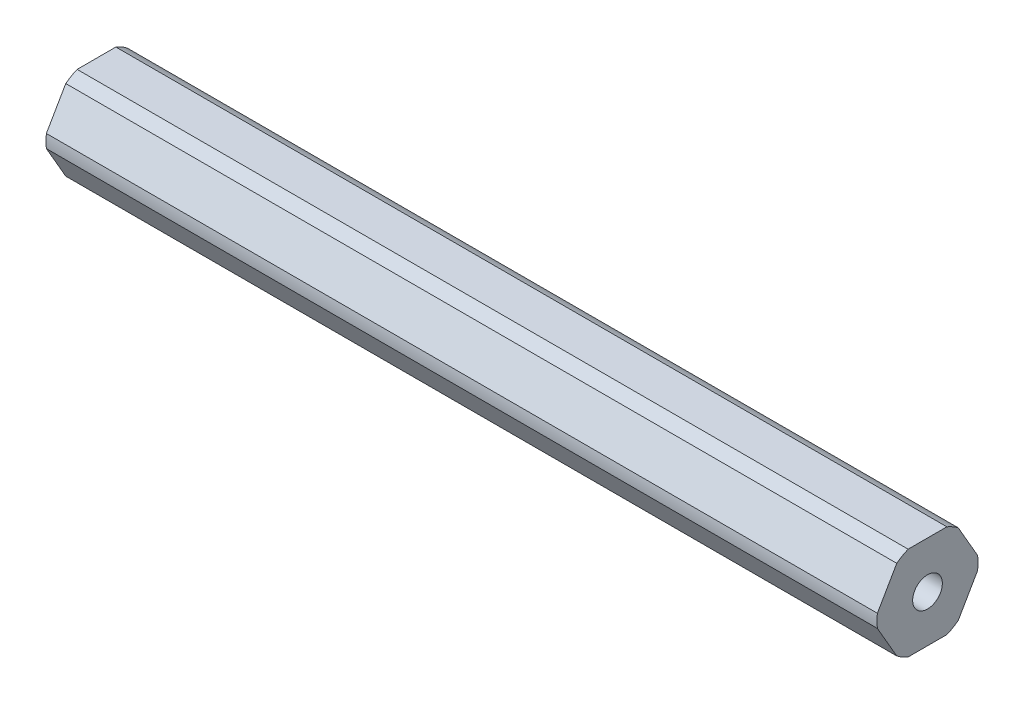
ISO-10303-21;
HEADER;
FILE_DESCRIPTION(('STEP AP214'),'2;1');
FILE_NAME('part.step','',(''),(''),'','','');
FILE_SCHEMA(('AUTOMOTIVE_DESIGN { 1 0 10303 214 1 1 1 1 }'));
ENDSEC;
DATA;
#1=APPLICATION_CONTEXT('core data for automotive mechanical design processes');
#2=APPLICATION_PROTOCOL_DEFINITION('international standard','automotive_design',2000,#1);
#3=PRODUCT_CONTEXT('',#1,'mechanical');
#4=PRODUCT('Part','Part','',(#3));
#5=PRODUCT_RELATED_PRODUCT_CATEGORY('part','',(#4));
#6=PRODUCT_DEFINITION_FORMATION('','',#4);
#7=PRODUCT_DEFINITION_CONTEXT('part definition',#1,'design');
#8=PRODUCT_DEFINITION('design','',#6,#7);
#9=PRODUCT_DEFINITION_SHAPE('','',#8);
#10=(LENGTH_UNIT() NAMED_UNIT(*) SI_UNIT(.MILLI.,.METRE.));
#11=(NAMED_UNIT(*) PLANE_ANGLE_UNIT() SI_UNIT($,.RADIAN.));
#12=(NAMED_UNIT(*) SI_UNIT($,.STERADIAN.) SOLID_ANGLE_UNIT());
#13=UNCERTAINTY_MEASURE_WITH_UNIT(LENGTH_MEASURE(1.E-05),#10,'distance_accuracy_value','');
#14=(GEOMETRIC_REPRESENTATION_CONTEXT(3) GLOBAL_UNCERTAINTY_ASSIGNED_CONTEXT((#13)) GLOBAL_UNIT_ASSIGNED_CONTEXT((#10,
#11,#12)) REPRESENTATION_CONTEXT('',''));
#15=CARTESIAN_POINT('',(0.,0.,0.));
#16=DIRECTION('',(0.,0.,1.));
#17=DIRECTION('',(1.,0.,0.));
#18=AXIS2_PLACEMENT_3D('',#15,#16,#17);
#19=CARTESIAN_POINT('',(56.515,3.17499999999999,-5.49926131403116));
#20=DIRECTION('',(0.,-0.500000000000001,0.866025403784438));
#21=DIRECTION('',(0.,-0.866025403784438,-0.500000000000001));
#22=AXIS2_PLACEMENT_3D('',#19,#20,#21);
#23=PLANE('',#22);
#24=DIRECTION('',(0.,0.866025403784438,0.500000000000001));
#25=VECTOR('',#24,1.);
#26=CARTESIAN_POINT('',(-56.515,3.17499999999999,-5.49926131403116));
#27=LINE('',#26,#25);
#28=CARTESIAN_POINT('',(-56.515,0.89303957103212,-6.81675178197584));
#29=VERTEX_POINT('',#28);
#30=CARTESIAN_POINT('',(-56.515,5.45696042896787,-4.18177084608648));
#31=VERTEX_POINT('',#30);
#32=EDGE_CURVE('E161',#29,#31,#27,.T.);
#33=ORIENTED_EDGE('',*,*,#32,.T.);
#34=DIRECTION('',(-1.,0.,0.));
#35=VECTOR('',#34,1.);
#36=CARTESIAN_POINT('',(56.515,5.45696042896787,-4.18177084608648));
#37=LINE('',#36,#35);
#38=CARTESIAN_POINT('',(56.515,5.45696042896787,-4.18177084608648));
#39=VERTEX_POINT('',#38);
#40=EDGE_CURVE('E11',#39,#31,#37,.T.);
#41=ORIENTED_EDGE('',*,*,#40,.F.);
#42=DIRECTION('',(0.,0.866025403784438,0.500000000000001));
#43=VECTOR('',#42,1.);
#44=CARTESIAN_POINT('',(56.515,3.17499999999999,-5.49926131403116));
#45=LINE('',#44,#43);
#46=CARTESIAN_POINT('',(56.515,0.89303957103212,-6.81675178197584));
#47=VERTEX_POINT('',#46);
#48=EDGE_CURVE('E220',#47,#39,#45,.T.);
#49=ORIENTED_EDGE('',*,*,#48,.F.);
#50=DIRECTION('',(-1.,0.,0.));
#51=VECTOR('',#50,1.);
#52=CARTESIAN_POINT('',(56.515,0.89303957103212,-6.81675178197584));
#53=LINE('',#52,#51);
#54=EDGE_CURVE('E154',#47,#29,#53,.T.);
#55=ORIENTED_EDGE('',*,*,#54,.T.);
#56=EDGE_LOOP('',(#33,#41,#49,#55));
#57=FACE_BOUND('',#56,.T.);
#58=ADVANCED_FACE('F36',(#57),#23,.F.);
#59=CARTESIAN_POINT('',(56.515,0.,0.));
#60=DIRECTION('',(-1.,0.,0.));
#61=DIRECTION('',(0.,0.,1.));
#62=AXIS2_PLACEMENT_3D('',#59,#60,#61);
#63=CYLINDRICAL_SURFACE('',#62,6.874999966);
#64=CARTESIAN_POINT('',(-56.515,0.,0.));
#65=DIRECTION('',(1.,0.,0.));
#66=DIRECTION('',(0.,0.,-1.));
#67=AXIS2_PLACEMENT_3D('',#64,#65,#66);
#68=CIRCLE('',#67,6.874999966);
#69=CARTESIAN_POINT('',(-56.515,6.34999999999998,-2.63498093588933));
#70=VERTEX_POINT('',#69);
#71=EDGE_CURVE('E164',#31,#70,#68,.T.);
#72=ORIENTED_EDGE('',*,*,#71,.T.);
#73=DIRECTION('',(-1.,0.,0.));
#74=VECTOR('',#73,1.);
#75=CARTESIAN_POINT('',(56.515,6.34999999999998,-2.63498093588933));
#76=LINE('',#75,#74);
#77=CARTESIAN_POINT('',(56.515,6.34999999999998,-2.63498093588933));
#78=VERTEX_POINT('',#77);
#79=EDGE_CURVE('E45',#78,#70,#76,.T.);
#80=ORIENTED_EDGE('',*,*,#79,.F.);
#81=CARTESIAN_POINT('',(56.515,0.,0.));
#82=DIRECTION('',(1.,0.,0.));
#83=DIRECTION('',(0.,0.,-1.));
#84=AXIS2_PLACEMENT_3D('',#81,#82,#83);
#85=CIRCLE('',#84,6.874999966);
#86=EDGE_CURVE('E108',#39,#78,#85,.T.);
#87=ORIENTED_EDGE('',*,*,#86,.F.);
#88=ORIENTED_EDGE('',*,*,#40,.T.);
#89=EDGE_LOOP('',(#72,#80,#87,#88));
#90=FACE_BOUND('',#89,.T.);
#91=ADVANCED_FACE('F255',(#90),#63,.T.);
#92=CARTESIAN_POINT('',(56.515,6.34999999999997,0.));
#93=DIRECTION('',(0.,-1.,0.));
#94=DIRECTION('',(0.,0.,-1.));
#95=AXIS2_PLACEMENT_3D('',#92,#93,#94);
#96=PLANE('',#95);
#97=DIRECTION('',(0.,0.,1.));
#98=VECTOR('',#97,1.);
#99=CARTESIAN_POINT('',(-56.515,6.34999999999997,0.));
#100=LINE('',#99,#98);
#101=CARTESIAN_POINT('',(-56.515,6.34999999999997,2.63498093588938));
#102=VERTEX_POINT('',#101);
#103=EDGE_CURVE('E166',#70,#102,#100,.T.);
#104=ORIENTED_EDGE('',*,*,#103,.T.);
#105=DIRECTION('',(-1.,0.,0.));
#106=VECTOR('',#105,1.);
#107=CARTESIAN_POINT('',(56.515,6.34999999999997,2.63498093588938));
#108=LINE('',#107,#106);
#109=CARTESIAN_POINT('',(56.515,6.34999999999997,2.63498093588938));
#110=VERTEX_POINT('',#109);
#111=EDGE_CURVE('E196',#110,#102,#108,.T.);
#112=ORIENTED_EDGE('',*,*,#111,.F.);
#113=DIRECTION('',(0.,0.,1.));
#114=VECTOR('',#113,1.);
#115=CARTESIAN_POINT('',(56.515,6.34999999999997,0.));
#116=LINE('',#115,#114);
#117=EDGE_CURVE('E204',#78,#110,#116,.T.);
#118=ORIENTED_EDGE('',*,*,#117,.F.);
#119=ORIENTED_EDGE('',*,*,#79,.T.);
#120=EDGE_LOOP('',(#104,#112,#118,#119));
#121=FACE_BOUND('',#120,.T.);
#122=ADVANCED_FACE('F202',(#121),#96,.F.);
#123=CARTESIAN_POINT('',(-56.515,5.45696042896784,4.18177084608651));
#124=VERTEX_POINT('',#123);
#125=EDGE_CURVE('E167',#102,#124,#68,.T.);
#126=ORIENTED_EDGE('',*,*,#125,.T.);
#127=DIRECTION('',(-1.,0.,0.));
#128=VECTOR('',#127,1.);
#129=CARTESIAN_POINT('',(56.515,5.45696042896784,4.18177084608651));
#130=LINE('',#129,#128);
#131=CARTESIAN_POINT('',(56.515,5.45696042896784,4.18177084608651));
#132=VERTEX_POINT('',#131);
#133=EDGE_CURVE('E193',#132,#124,#130,.T.);
#134=ORIENTED_EDGE('',*,*,#133,.F.);
#135=EDGE_CURVE('E226',#110,#132,#85,.T.);
#136=ORIENTED_EDGE('',*,*,#135,.F.);
#137=ORIENTED_EDGE('',*,*,#111,.T.);
#138=EDGE_LOOP('',(#126,#134,#136,#137));
#139=FACE_BOUND('',#138,.T.);
#140=ADVANCED_FACE('F237',(#139),#63,.T.);
#141=CARTESIAN_POINT('',(56.515,3.17499999999995,5.49926131403118));
#142=DIRECTION('',(0.,-0.499999999999995,-0.866025403784442));
#143=DIRECTION('',(0.,0.866025403784442,-0.499999999999995));
#144=AXIS2_PLACEMENT_3D('',#141,#142,#143);
#145=PLANE('',#144);
#146=DIRECTION('',(0.,-0.866025403784442,0.499999999999995));
#147=VECTOR('',#146,1.);
#148=CARTESIAN_POINT('',(-56.515,3.17499999999995,5.49926131403118));
#149=LINE('',#148,#147);
#150=CARTESIAN_POINT('',(-56.515,0.893039571032066,6.81675178197585));
#151=VERTEX_POINT('',#150);
#152=EDGE_CURVE('E169',#124,#151,#149,.T.);
#153=ORIENTED_EDGE('',*,*,#152,.T.);
#154=DIRECTION('',(-1.,0.,0.));
#155=VECTOR('',#154,1.);
#156=CARTESIAN_POINT('',(56.515,0.893039571032066,6.81675178197585));
#157=LINE('',#156,#155);
#158=CARTESIAN_POINT('',(56.515,0.893039571032066,6.81675178197585));
#159=VERTEX_POINT('',#158);
#160=EDGE_CURVE('E190',#159,#151,#157,.T.);
#161=ORIENTED_EDGE('',*,*,#160,.F.);
#162=DIRECTION('',(0.,-0.866025403784442,0.499999999999995));
#163=VECTOR('',#162,1.);
#164=CARTESIAN_POINT('',(56.515,3.17499999999995,5.49926131403118));
#165=LINE('',#164,#163);
#166=EDGE_CURVE('E228',#132,#159,#165,.T.);
#167=ORIENTED_EDGE('',*,*,#166,.F.);
#168=ORIENTED_EDGE('',*,*,#133,.T.);
#169=EDGE_LOOP('',(#153,#161,#167,#168));
#170=FACE_BOUND('',#169,.T.);
#171=ADVANCED_FACE('F239',(#170),#145,.F.);
#172=CARTESIAN_POINT('',(-56.515,-0.893039571032163,6.81675178197583));
#173=VERTEX_POINT('',#172);
#174=EDGE_CURVE('E171',#151,#173,#68,.T.);
#175=ORIENTED_EDGE('',*,*,#174,.T.);
#176=DIRECTION('',(-1.,0.,0.));
#177=VECTOR('',#176,1.);
#178=CARTESIAN_POINT('',(56.515,-0.893039571032163,6.81675178197583));
#179=LINE('',#178,#177);
#180=CARTESIAN_POINT('',(56.515,-0.893039571032163,6.81675178197583));
#181=VERTEX_POINT('',#180);
#182=EDGE_CURVE('E187',#181,#173,#179,.T.);
#183=ORIENTED_EDGE('',*,*,#182,.F.);
#184=EDGE_CURVE('E229',#159,#181,#85,.T.);
#185=ORIENTED_EDGE('',*,*,#184,.F.);
#186=ORIENTED_EDGE('',*,*,#160,.T.);
#187=EDGE_LOOP('',(#175,#183,#185,#186));
#188=FACE_BOUND('',#187,.T.);
#189=ADVANCED_FACE('F240',(#188),#63,.T.);
#190=CARTESIAN_POINT('',(56.515,-3.17500000000003,5.49926131403114));
#191=DIRECTION('',(0.,0.500000000000007,-0.866025403784434));
#192=DIRECTION('',(0.,0.866025403784435,0.500000000000007));
#193=AXIS2_PLACEMENT_3D('',#190,#191,#192);
#194=PLANE('',#193);
#195=DIRECTION('',(0.,-0.866025403784435,-0.500000000000007));
#196=VECTOR('',#195,1.);
#197=CARTESIAN_POINT('',(-56.515,-3.17500000000003,5.49926131403114));
#198=LINE('',#197,#196);
#199=CARTESIAN_POINT('',(-56.515,-5.4569604289679,4.18177084608644));
#200=VERTEX_POINT('',#199);
#201=EDGE_CURVE('E172',#173,#200,#198,.T.);
#202=ORIENTED_EDGE('',*,*,#201,.T.);
#203=DIRECTION('',(-1.,0.,0.));
#204=VECTOR('',#203,1.);
#205=CARTESIAN_POINT('',(56.515,-5.4569604289679,4.18177084608644));
#206=LINE('',#205,#204);
#207=CARTESIAN_POINT('',(56.515,-5.4569604289679,4.18177084608644));
#208=VERTEX_POINT('',#207);
#209=EDGE_CURVE('E184',#208,#200,#206,.T.);
#210=ORIENTED_EDGE('',*,*,#209,.F.);
#211=DIRECTION('',(0.,-0.866025403784435,-0.500000000000007));
#212=VECTOR('',#211,1.);
#213=CARTESIAN_POINT('',(56.515,-3.17500000000003,5.49926131403114));
#214=LINE('',#213,#212);
#215=EDGE_CURVE('E230',#181,#208,#214,.T.);
#216=ORIENTED_EDGE('',*,*,#215,.F.);
#217=ORIENTED_EDGE('',*,*,#182,.T.);
#218=EDGE_LOOP('',(#202,#210,#216,#217));
#219=FACE_BOUND('',#218,.T.);
#220=ADVANCED_FACE('F243',(#219),#194,.F.);
#221=CARTESIAN_POINT('',(-56.515,-6.35,2.63498093588929));
#222=VERTEX_POINT('',#221);
#223=EDGE_CURVE('E174',#200,#222,#68,.T.);
#224=ORIENTED_EDGE('',*,*,#223,.T.);
#225=DIRECTION('',(-1.,0.,0.));
#226=VECTOR('',#225,1.);
#227=CARTESIAN_POINT('',(56.515,-6.35,2.63498093588929));
#228=LINE('',#227,#226);
#229=CARTESIAN_POINT('',(56.515,-6.35,2.63498093588929));
#230=VERTEX_POINT('',#229);
#231=EDGE_CURVE('E181',#230,#222,#228,.T.);
#232=ORIENTED_EDGE('',*,*,#231,.F.);
#233=EDGE_CURVE('E144',#208,#230,#85,.T.);
#234=ORIENTED_EDGE('',*,*,#233,.F.);
#235=ORIENTED_EDGE('',*,*,#209,.T.);
#236=EDGE_LOOP('',(#224,#232,#234,#235));
#237=FACE_BOUND('',#236,.T.);
#238=ADVANCED_FACE('F245',(#237),#63,.T.);
#239=CARTESIAN_POINT('',(56.515,-6.34999999999997,0.));
#240=DIRECTION('',(0.,1.,0.));
#241=DIRECTION('',(0.,0.,1.));
#242=AXIS2_PLACEMENT_3D('',#239,#240,#241);
#243=PLANE('',#242);
#244=DIRECTION('',(0.,0.,-1.));
#245=VECTOR('',#244,1.);
#246=CARTESIAN_POINT('',(-56.515,-6.34999999999997,0.));
#247=LINE('',#246,#245);
#248=CARTESIAN_POINT('',(-56.515,-6.34999999999994,-2.63498093588942));
#249=VERTEX_POINT('',#248);
#250=EDGE_CURVE('E175',#222,#249,#247,.T.);
#251=ORIENTED_EDGE('',*,*,#250,.T.);
#252=DIRECTION('',(-1.,0.,0.));
#253=VECTOR('',#252,1.);
#254=CARTESIAN_POINT('',(56.515,-6.34999999999994,-2.63498093588942));
#255=LINE('',#254,#253);
#256=CARTESIAN_POINT('',(56.515,-6.34999999999994,-2.63498093588942));
#257=VERTEX_POINT('',#256);
#258=EDGE_CURVE('E149',#257,#249,#255,.T.);
#259=ORIENTED_EDGE('',*,*,#258,.F.);
#260=DIRECTION('',(0.,0.,-1.));
#261=VECTOR('',#260,1.);
#262=CARTESIAN_POINT('',(56.515,-6.34999999999997,0.));
#263=LINE('',#262,#261);
#264=EDGE_CURVE('E139',#230,#257,#263,.T.);
#265=ORIENTED_EDGE('',*,*,#264,.F.);
#266=ORIENTED_EDGE('',*,*,#231,.T.);
#267=EDGE_LOOP('',(#251,#259,#265,#266));
#268=FACE_BOUND('',#267,.T.);
#269=ADVANCED_FACE('F248',(#268),#243,.F.);
#270=CARTESIAN_POINT('',(-56.515,-5.4569604289678,-4.18177084608657));
#271=VERTEX_POINT('',#270);
#272=EDGE_CURVE('E148',#249,#271,#68,.T.);
#273=ORIENTED_EDGE('',*,*,#272,.T.);
#274=DIRECTION('',(-1.,0.,0.));
#275=VECTOR('',#274,1.);
#276=CARTESIAN_POINT('',(56.515,-5.4569604289678,-4.18177084608657));
#277=LINE('',#276,#275);
#278=CARTESIAN_POINT('',(56.515,-5.4569604289678,-4.18177084608657));
#279=VERTEX_POINT('',#278);
#280=EDGE_CURVE('E145',#279,#271,#277,.T.);
#281=ORIENTED_EDGE('',*,*,#280,.F.);
#282=EDGE_CURVE('E133',#257,#279,#85,.T.);
#283=ORIENTED_EDGE('',*,*,#282,.F.);
#284=ORIENTED_EDGE('',*,*,#258,.T.);
#285=EDGE_LOOP('',(#273,#281,#283,#284));
#286=FACE_BOUND('',#285,.T.);
#287=ADVANCED_FACE('F146',(#286),#63,.T.);
#288=CARTESIAN_POINT('',(56.515,-3.17499999999997,-5.4992613140312));
#289=DIRECTION('',(0.,0.499999999999995,0.866025403784441));
#290=DIRECTION('',(0.,-0.866025403784442,0.499999999999995));
#291=AXIS2_PLACEMENT_3D('',#288,#289,#290);
#292=PLANE('',#291);
#293=DIRECTION('',(0.,0.866025403784441,-0.499999999999995));
#294=VECTOR('',#293,1.);
#295=CARTESIAN_POINT('',(-56.515,-3.17499999999997,-5.4992613140312));
#296=LINE('',#295,#294);
#297=CARTESIAN_POINT('',(-56.515,-0.893039571032135,-6.81675178197584));
#298=VERTEX_POINT('',#297);
#299=EDGE_CURVE('E94',#271,#298,#296,.T.);
#300=ORIENTED_EDGE('',*,*,#299,.T.);
#301=DIRECTION('',(-1.,0.,0.));
#302=VECTOR('',#301,1.);
#303=CARTESIAN_POINT('',(56.515,-0.893039571032135,-6.81675178197584));
#304=LINE('',#303,#302);
#305=CARTESIAN_POINT('',(56.515,-0.893039571032135,-6.81675178197584));
#306=VERTEX_POINT('',#305);
#307=EDGE_CURVE('E150',#306,#298,#304,.T.);
#308=ORIENTED_EDGE('',*,*,#307,.F.);
#309=DIRECTION('',(0.,0.866025403784441,-0.499999999999995));
#310=VECTOR('',#309,1.);
#311=CARTESIAN_POINT('',(56.515,-3.17499999999997,-5.4992613140312));
#312=LINE('',#311,#310);
#313=EDGE_CURVE('E137',#279,#306,#312,.T.);
#314=ORIENTED_EDGE('',*,*,#313,.F.);
#315=ORIENTED_EDGE('',*,*,#280,.T.);
#316=EDGE_LOOP('',(#300,#308,#314,#315));
#317=FACE_BOUND('',#316,.T.);
#318=ADVANCED_FACE('F152',(#317),#292,.F.);
#319=CARTESIAN_POINT('',(56.515,0.,0.));
#320=DIRECTION('',(-1.,0.,0.));
#321=DIRECTION('',(0.,0.,1.));
#322=AXIS2_PLACEMENT_3D('',#319,#320,#321);
#323=CYLINDRICAL_SURFACE('',#322,2.0193);
#324=CARTESIAN_POINT('',(56.515,0.,0.));
#325=DIRECTION('',(1.,0.,0.));
#326=DIRECTION('',(0.,0.,-1.));
#327=AXIS2_PLACEMENT_3D('',#324,#325,#326);
#328=CIRCLE('',#327,2.0193);
#329=CARTESIAN_POINT('',(56.515,0.,2.0193));
#330=VERTEX_POINT('',#329);
#331=EDGE_CURVE('E218',#330,#330,#328,.T.);
#332=CARTESIAN_POINT('',(-56.515,0.,0.));
#333=DIRECTION('',(1.,0.,0.));
#334=DIRECTION('',(0.,0.,-1.));
#335=AXIS2_PLACEMENT_3D('',#332,#333,#334);
#336=CIRCLE('',#335,2.0193);
#337=CARTESIAN_POINT('',(-56.515,0.,2.0193));
#338=VERTEX_POINT('',#337);
#339=EDGE_CURVE('E158',#338,#338,#336,.T.);
#340=CARTESIAN_POINT('',(56.515,0.,2.0193));
#341=CARTESIAN_POINT('',(55.3376041666667,0.,2.0193));
#342=CARTESIAN_POINT('',(54.1602083333333,0.,2.0193));
#343=CARTESIAN_POINT('',(51.8054166666667,0.,2.0193));
#344=CARTESIAN_POINT('',(50.6280208333333,0.,2.0193));
#345=CARTESIAN_POINT('',(48.2732291666667,0.,2.0193));
#346=CARTESIAN_POINT('',(47.0958333333333,0.,2.0193));
#347=CARTESIAN_POINT('',(44.7410416666667,0.,2.0193));
#348=CARTESIAN_POINT('',(43.5636458333333,0.,2.0193));
#349=CARTESIAN_POINT('',(41.2088541666667,0.,2.0193));
#350=CARTESIAN_POINT('',(40.0314583333333,0.,2.0193));
#351=CARTESIAN_POINT('',(37.6766666666667,0.,2.0193));
#352=CARTESIAN_POINT('',(36.4992708333333,0.,2.0193));
#353=CARTESIAN_POINT('',(34.1444791666667,0.,2.0193));
#354=CARTESIAN_POINT('',(32.9670833333333,0.,2.0193));
#355=CARTESIAN_POINT('',(30.6122916666667,0.,2.0193));
#356=CARTESIAN_POINT('',(29.4348958333333,0.,2.0193));
#357=CARTESIAN_POINT('',(27.0801041666667,0.,2.0193));
#358=CARTESIAN_POINT('',(25.9027083333333,0.,2.0193));
#359=CARTESIAN_POINT('',(23.5479166666667,0.,2.0193));
#360=CARTESIAN_POINT('',(22.3705208333333,0.,2.0193));
#361=CARTESIAN_POINT('',(20.0157291666667,0.,2.0193));
#362=CARTESIAN_POINT('',(18.8383333333333,0.,2.0193));
#363=CARTESIAN_POINT('',(16.4835416666667,0.,2.0193));
#364=CARTESIAN_POINT('',(15.3061458333333,0.,2.0193));
#365=CARTESIAN_POINT('',(12.9513541666667,0.,2.0193));
#366=CARTESIAN_POINT('',(11.7739583333333,0.,2.0193));
#367=CARTESIAN_POINT('',(9.41916666666666,0.,2.0193));
#368=CARTESIAN_POINT('',(8.24177083333332,0.,2.0193));
#369=CARTESIAN_POINT('',(5.88697916666666,0.,2.0193));
#370=CARTESIAN_POINT('',(4.70958333333332,0.,2.0193));
#371=CARTESIAN_POINT('',(2.35479166666666,0.,2.0193));
#372=CARTESIAN_POINT('',(1.17739583333333,0.,2.0193));
#373=CARTESIAN_POINT('',(-1.17739583333334,0.,2.0193));
#374=CARTESIAN_POINT('',(-2.35479166666667,0.,2.0193));
#375=CARTESIAN_POINT('',(-4.70958333333333,0.,2.0193));
#376=CARTESIAN_POINT('',(-5.88697916666666,0.,2.0193));
#377=CARTESIAN_POINT('',(-8.24177083333333,0.,2.0193));
#378=CARTESIAN_POINT('',(-9.41916666666666,0.,2.0193));
#379=CARTESIAN_POINT('',(-11.7739583333333,0.,2.0193));
#380=CARTESIAN_POINT('',(-12.9513541666667,0.,2.0193));
#381=CARTESIAN_POINT('',(-15.3061458333333,0.,2.0193));
#382=CARTESIAN_POINT('',(-16.4835416666667,0.,2.0193));
#383=CARTESIAN_POINT('',(-18.8383333333333,0.,2.0193));
#384=CARTESIAN_POINT('',(-20.0157291666667,0.,2.0193));
#385=CARTESIAN_POINT('',(-22.3705208333333,0.,2.0193));
#386=CARTESIAN_POINT('',(-23.5479166666667,0.,2.0193));
#387=CARTESIAN_POINT('',(-25.9027083333333,0.,2.0193));
#388=CARTESIAN_POINT('',(-27.0801041666667,0.,2.0193));
#389=CARTESIAN_POINT('',(-29.4348958333333,0.,2.0193));
#390=CARTESIAN_POINT('',(-30.6122916666667,0.,2.0193));
#391=CARTESIAN_POINT('',(-32.9670833333333,0.,2.0193));
#392=CARTESIAN_POINT('',(-34.1444791666667,0.,2.0193));
#393=CARTESIAN_POINT('',(-36.4992708333333,0.,2.0193));
#394=CARTESIAN_POINT('',(-37.6766666666667,0.,2.0193));
#395=CARTESIAN_POINT('',(-40.0314583333333,0.,2.0193));
#396=CARTESIAN_POINT('',(-41.2088541666667,0.,2.0193));
#397=CARTESIAN_POINT('',(-43.5636458333333,0.,2.0193));
#398=CARTESIAN_POINT('',(-44.7410416666667,0.,2.0193));
#399=CARTESIAN_POINT('',(-47.0958333333333,0.,2.0193));
#400=CARTESIAN_POINT('',(-48.2732291666667,0.,2.0193));
#401=CARTESIAN_POINT('',(-50.6280208333333,0.,2.0193));
#402=CARTESIAN_POINT('',(-51.8054166666667,0.,2.0193));
#403=CARTESIAN_POINT('',(-54.1602083333333,0.,2.0193));
#404=CARTESIAN_POINT('',(-55.3376041666667,0.,2.0193));
#405=CARTESIAN_POINT('',(-56.515,0.,2.0193));
#406=B_SPLINE_CURVE_WITH_KNOTS('',3,(#340,#341,#342,#343,#344,#345,#346,#347,#348,#349,#350,
#351,#352,#353,#354,#355,#356,#357,#358,#359,#360,#361,#362,#363,#364,#365,#366,#367,#368,#369,
#370,#371,#372,#373,#374,#375,#376,#377,#378,#379,#380,#381,#382,#383,#384,#385,#386,#387,#388,
#389,#390,#391,#392,#393,#394,#395,#396,#397,#398,#399,#400,#401,#402,#403,#404,#405),
.UNSPECIFIED.,.F.,.F.,(4,2,2,2,2,2,2,2,2,2,2,2,2,2,2,2,2,2,2,2,2,2,2,2,2,2,2,2,2,2,2,2,4),(0.,
3.5321875,7.064375,10.5965625,14.12875,17.6609375,21.193125,24.7253125,28.2575,31.7896875,
35.321875,38.8540625,42.38625,45.9184375,49.450625,52.9828125,56.515,60.0471875,63.579375,
67.1115625,70.64375,74.1759375,77.708125,81.2403125,84.7725,88.3046875,91.836875,95.3690625,
98.90125,102.4334375,105.965625,109.4978125,113.03),.UNSPECIFIED.);
#407=EDGE_CURVE('BSEAM38',#330,#338,#406,.T.);
#408=ORIENTED_EDGE('',*,*,#331,.T.);
#409=ORIENTED_EDGE('',*,*,#339,.F.);
#410=ORIENTED_EDGE('',*,*,#407,.T.);
#411=ORIENTED_EDGE('',*,*,#407,.F.);
#412=EDGE_LOOP('',(#408,#410,#409,#411));
#413=FACE_BOUND('',#412,.T.);
#414=ADVANCED_FACE('F38',(#413),#323,.F.);
#415=EDGE_CURVE('E100',#298,#29,#68,.T.);
#416=ORIENTED_EDGE('',*,*,#415,.T.);
#417=ORIENTED_EDGE('',*,*,#54,.F.);
#418=EDGE_CURVE('E53',#306,#47,#85,.T.);
#419=ORIENTED_EDGE('',*,*,#418,.F.);
#420=ORIENTED_EDGE('',*,*,#307,.T.);
#421=EDGE_LOOP('',(#416,#417,#419,#420));
#422=FACE_BOUND('',#421,.T.);
#423=ADVANCED_FACE('F252',(#422),#63,.T.);
#424=CARTESIAN_POINT('',(56.515,0.,0.));
#425=DIRECTION('',(1.,0.,0.));
#426=DIRECTION('',(0.,0.,-1.));
#427=AXIS2_PLACEMENT_3D('',#424,#425,#426);
#428=PLANE('',#427);
#429=ORIENTED_EDGE('',*,*,#331,.F.);
#430=EDGE_LOOP('',(#429));
#431=FACE_BOUND('',#430,.T.);
#432=ORIENTED_EDGE('',*,*,#48,.T.);
#433=ORIENTED_EDGE('',*,*,#86,.T.);
#434=ORIENTED_EDGE('',*,*,#117,.T.);
#435=ORIENTED_EDGE('',*,*,#135,.T.);
#436=ORIENTED_EDGE('',*,*,#166,.T.);
#437=ORIENTED_EDGE('',*,*,#184,.T.);
#438=ORIENTED_EDGE('',*,*,#215,.T.);
#439=ORIENTED_EDGE('',*,*,#233,.T.);
#440=ORIENTED_EDGE('',*,*,#264,.T.);
#441=ORIENTED_EDGE('',*,*,#282,.T.);
#442=ORIENTED_EDGE('',*,*,#313,.T.);
#443=ORIENTED_EDGE('',*,*,#418,.T.);
#444=EDGE_LOOP('',(#432,#433,#434,#435,#436,#437,#438,#439,#440,#441,#442,#443));
#445=FACE_BOUND('',#444,.T.);
#446=ADVANCED_FACE('F135',(#431,#445),#428,.T.);
#447=CARTESIAN_POINT('',(-56.515,0.,0.));
#448=DIRECTION('',(1.,0.,0.));
#449=DIRECTION('',(0.,0.,-1.));
#450=AXIS2_PLACEMENT_3D('',#447,#448,#449);
#451=PLANE('',#450);
#452=ORIENTED_EDGE('',*,*,#339,.T.);
#453=EDGE_LOOP('',(#452));
#454=FACE_BOUND('',#453,.T.);
#455=ORIENTED_EDGE('',*,*,#32,.F.);
#456=ORIENTED_EDGE('',*,*,#415,.F.);
#457=ORIENTED_EDGE('',*,*,#299,.F.);
#458=ORIENTED_EDGE('',*,*,#272,.F.);
#459=ORIENTED_EDGE('',*,*,#250,.F.);
#460=ORIENTED_EDGE('',*,*,#223,.F.);
#461=ORIENTED_EDGE('',*,*,#201,.F.);
#462=ORIENTED_EDGE('',*,*,#174,.F.);
#463=ORIENTED_EDGE('',*,*,#152,.F.);
#464=ORIENTED_EDGE('',*,*,#125,.F.);
#465=ORIENTED_EDGE('',*,*,#103,.F.);
#466=ORIENTED_EDGE('',*,*,#71,.F.);
#467=EDGE_LOOP('',(#455,#456,#457,#458,#459,#460,#461,#462,#463,#464,#465,#466));
#468=FACE_BOUND('',#467,.T.);
#469=ADVANCED_FACE('F208',(#454,#468),#451,.F.);
#470=CLOSED_SHELL('',(#58,#91,#122,#140,#171,#189,#220,#238,#269,#287,#318,#414,#423,#446,#469));
#471=MANIFOLD_SOLID_BREP('B2',#470);
#472=ADVANCED_BREP_SHAPE_REPRESENTATION('',(#18,#471),#14);
#473=SHAPE_DEFINITION_REPRESENTATION(#9,#472);
ENDSEC;
END-ISO-10303-21;
